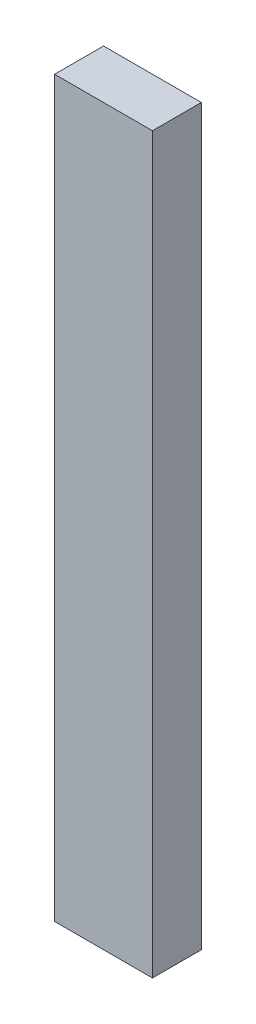
ISO-10303-21;
HEADER;
FILE_DESCRIPTION(('STEP AP214'),'2;1');
FILE_NAME('part.step','',(''),(''),'','','');
FILE_SCHEMA(('AUTOMOTIVE_DESIGN { 1 0 10303 214 1 1 1 1 }'));
ENDSEC;
DATA;
#1=APPLICATION_CONTEXT('core data for automotive mechanical design processes');
#2=APPLICATION_PROTOCOL_DEFINITION('international standard','automotive_design',2000,#1);
#3=PRODUCT_CONTEXT('',#1,'mechanical');
#4=PRODUCT('Part','Part','',(#3));
#5=PRODUCT_RELATED_PRODUCT_CATEGORY('part','',(#4));
#6=PRODUCT_DEFINITION_FORMATION('','',#4);
#7=PRODUCT_DEFINITION_CONTEXT('part definition',#1,'design');
#8=PRODUCT_DEFINITION('design','',#6,#7);
#9=PRODUCT_DEFINITION_SHAPE('','',#8);
#10=(LENGTH_UNIT() NAMED_UNIT(*) SI_UNIT(.MILLI.,.METRE.));
#11=(NAMED_UNIT(*) PLANE_ANGLE_UNIT() SI_UNIT($,.RADIAN.));
#12=(NAMED_UNIT(*) SI_UNIT($,.STERADIAN.) SOLID_ANGLE_UNIT());
#13=UNCERTAINTY_MEASURE_WITH_UNIT(LENGTH_MEASURE(1.E-05),#10,'distance_accuracy_value','');
#14=(GEOMETRIC_REPRESENTATION_CONTEXT(3) GLOBAL_UNCERTAINTY_ASSIGNED_CONTEXT((#13)) GLOBAL_UNIT_ASSIGNED_CONTEXT((#10,
#11,#12)) REPRESENTATION_CONTEXT('',''));
#15=CARTESIAN_POINT('',(0.,0.,0.));
#16=DIRECTION('',(0.,0.,1.));
#17=DIRECTION('',(1.,0.,0.));
#18=AXIS2_PLACEMENT_3D('',#15,#16,#17);
#19=CARTESIAN_POINT('',(0.,0.,0.));
#20=DIRECTION('',(0.,0.,1.));
#21=DIRECTION('',(1.,0.,0.));
#22=AXIS2_PLACEMENT_3D('',#19,#20,#21);
#23=PLANE('',#22);
#24=DIRECTION('',(0.,-1.,0.));
#25=VECTOR('',#24,1.);
#26=CARTESIAN_POINT('',(-51.9451952835684,48.2526807372689,0.));
#27=LINE('',#26,#25);
#28=CARTESIAN_POINT('',(-51.9451952835684,48.2526807372689,0.));
#29=VERTEX_POINT('',#28);
#30=CARTESIAN_POINT('',(-51.9451952835684,-101.747319262731,0.));
#31=VERTEX_POINT('',#30);
#32=EDGE_CURVE('E118',#29,#31,#27,.T.);
#33=ORIENTED_EDGE('',*,*,#32,.F.);
#34=DIRECTION('',(-1.,0.,0.));
#35=VECTOR('',#34,1.);
#36=CARTESIAN_POINT('',(-51.9451952835684,48.2526807372689,0.));
#37=LINE('',#36,#35);
#38=CARTESIAN_POINT('',(-31.9451952835684,48.2526807372689,0.));
#39=VERTEX_POINT('',#38);
#40=EDGE_CURVE('E189',#39,#29,#37,.T.);
#41=ORIENTED_EDGE('',*,*,#40,.F.);
#42=DIRECTION('',(0.,1.,0.));
#43=VECTOR('',#42,1.);
#44=CARTESIAN_POINT('',(-31.9451952835684,48.2526807372689,0.));
#45=LINE('',#44,#43);
#46=CARTESIAN_POINT('',(-31.9451952835684,-101.747319262731,0.));
#47=VERTEX_POINT('',#46);
#48=EDGE_CURVE('E186',#47,#39,#45,.T.);
#49=ORIENTED_EDGE('',*,*,#48,.F.);
#50=DIRECTION('',(1.,0.,0.));
#51=VECTOR('',#50,1.);
#52=CARTESIAN_POINT('',(-51.9451952835684,-101.747319262731,0.));
#53=LINE('',#52,#51);
#54=EDGE_CURVE('E183',#31,#47,#53,.T.);
#55=ORIENTED_EDGE('',*,*,#54,.F.);
#56=EDGE_LOOP('',(#33,#41,#49,#55));
#57=FACE_BOUND('',#56,.T.);
#58=CARTESIAN_POINT('',(-41.9451952835684,38.2526807372689,0.));
#59=DIRECTION('',(0.,0.,1.));
#60=DIRECTION('',(1.,0.,0.));
#61=AXIS2_PLACEMENT_3D('',#58,#59,#60);
#62=CIRCLE('',#61,3.55);
#63=CARTESIAN_POINT('',(-38.3951952835684,38.2526807372689,0.));
#64=VERTEX_POINT('',#63);
#65=CARTESIAN_POINT('',(-45.4951952835684,38.2526807372689,0.));
#66=VERTEX_POINT('',#65);
#67=EDGE_CURVE('E69',#64,#66,#62,.T.);
#68=ORIENTED_EDGE('',*,*,#67,.T.);
#69=DIRECTION('',(0.0343547085329042,-0.999409702775403,0.));
#70=VECTOR('',#69,1.);
#71=CARTESIAN_POINT('',(-45.4951952835684,38.2526807372689,0.));
#72=LINE('',#71,#70);
#73=CARTESIAN_POINT('',(-44.9451952835684,22.2526807372689,0.));
#74=VERTEX_POINT('',#73);
#75=EDGE_CURVE('E159',#66,#74,#72,.T.);
#76=ORIENTED_EDGE('',*,*,#75,.T.);
#77=CARTESIAN_POINT('',(-41.9451952835684,22.2526807372689,0.));
#78=DIRECTION('',(0.,0.,1.));
#79=DIRECTION('',(1.,0.,0.));
#80=AXIS2_PLACEMENT_3D('',#77,#78,#79);
#81=CIRCLE('',#80,3.);
#82=CARTESIAN_POINT('',(-38.9451952835684,22.2526807372689,0.));
#83=VERTEX_POINT('',#82);
#84=EDGE_CURVE('E163',#74,#83,#81,.T.);
#85=ORIENTED_EDGE('',*,*,#84,.T.);
#86=DIRECTION('',(0.0343547085329042,0.999409702775403,0.));
#87=VECTOR('',#86,1.);
#88=CARTESIAN_POINT('',(-38.3951952835684,38.2526807372689,0.));
#89=LINE('',#88,#87);
#90=EDGE_CURVE('E146',#83,#64,#89,.T.);
#91=ORIENTED_EDGE('',*,*,#90,.T.);
#92=EDGE_LOOP('',(#68,#76,#85,#91));
#93=FACE_BOUND('',#92,.T.);
#94=ADVANCED_FACE('F45',(#57,#93),#23,.F.);
#95=CARTESIAN_POINT('',(-51.9451952835684,48.2526807372689,5.));
#96=DIRECTION('',(1.,0.,0.));
#97=DIRECTION('',(0.,1.,0.));
#98=AXIS2_PLACEMENT_3D('',#95,#96,#97);
#99=PLANE('',#98);
#100=ORIENTED_EDGE('',*,*,#32,.T.);
#101=DIRECTION('',(0.,0.,-1.));
#102=VECTOR('',#101,1.);
#103=CARTESIAN_POINT('',(-51.9451952835684,-101.747319262731,5.));
#104=LINE('',#103,#102);
#105=CARTESIAN_POINT('',(-51.9451952835684,-101.747319262731,10.));
#106=VERTEX_POINT('',#105);
#107=EDGE_CURVE('E11',#106,#31,#104,.T.);
#108=ORIENTED_EDGE('',*,*,#107,.F.);
#109=DIRECTION('',(0.,-1.,0.));
#110=VECTOR('',#109,1.);
#111=CARTESIAN_POINT('',(-51.9451952835684,48.2526807372689,10.));
#112=LINE('',#111,#110);
#113=CARTESIAN_POINT('',(-51.9451952835684,48.2526807372689,10.));
#114=VERTEX_POINT('',#113);
#115=EDGE_CURVE('E116',#114,#106,#112,.T.);
#116=ORIENTED_EDGE('',*,*,#115,.F.);
#117=DIRECTION('',(0.,0.,-1.));
#118=VECTOR('',#117,1.);
#119=CARTESIAN_POINT('',(-51.9451952835684,48.2526807372689,5.));
#120=LINE('',#119,#118);
#121=EDGE_CURVE('E192',#114,#29,#120,.T.);
#122=ORIENTED_EDGE('',*,*,#121,.T.);
#123=EDGE_LOOP('',(#100,#108,#116,#122));
#124=FACE_BOUND('',#123,.T.);
#125=ADVANCED_FACE('F47',(#124),#99,.F.);
#126=CARTESIAN_POINT('',(-51.9451952835684,-101.747319262731,5.));
#127=DIRECTION('',(0.,1.,0.));
#128=DIRECTION('',(0.,0.,1.));
#129=AXIS2_PLACEMENT_3D('',#126,#127,#128);
#130=PLANE('',#129);
#131=ORIENTED_EDGE('',*,*,#54,.T.);
#132=DIRECTION('',(0.,0.,-1.));
#133=VECTOR('',#132,1.);
#134=CARTESIAN_POINT('',(-31.9451952835684,-101.747319262731,5.));
#135=LINE('',#134,#133);
#136=CARTESIAN_POINT('',(-31.9451952835684,-101.747319262731,10.));
#137=VERTEX_POINT('',#136);
#138=EDGE_CURVE('E54',#137,#47,#135,.T.);
#139=ORIENTED_EDGE('',*,*,#138,.F.);
#140=DIRECTION('',(1.,0.,0.));
#141=VECTOR('',#140,1.);
#142=CARTESIAN_POINT('',(-51.9451952835684,-101.747319262731,10.));
#143=LINE('',#142,#141);
#144=EDGE_CURVE('E121',#106,#137,#143,.T.);
#145=ORIENTED_EDGE('',*,*,#144,.F.);
#146=ORIENTED_EDGE('',*,*,#107,.T.);
#147=EDGE_LOOP('',(#131,#139,#145,#146));
#148=FACE_BOUND('',#147,.T.);
#149=ADVANCED_FACE('F122',(#148),#130,.F.);
#150=CARTESIAN_POINT('',(-31.9451952835684,48.2526807372689,5.));
#151=DIRECTION('',(-1.,0.,0.));
#152=DIRECTION('',(0.,-1.,0.));
#153=AXIS2_PLACEMENT_3D('',#150,#151,#152);
#154=PLANE('',#153);
#155=ORIENTED_EDGE('',*,*,#48,.T.);
#156=DIRECTION('',(0.,0.,-1.));
#157=VECTOR('',#156,1.);
#158=CARTESIAN_POINT('',(-31.9451952835684,48.2526807372689,5.));
#159=LINE('',#158,#157);
#160=CARTESIAN_POINT('',(-31.9451952835684,48.2526807372689,10.));
#161=VERTEX_POINT('',#160);
#162=EDGE_CURVE('E195',#161,#39,#159,.T.);
#163=ORIENTED_EDGE('',*,*,#162,.F.);
#164=DIRECTION('',(0.,1.,0.));
#165=VECTOR('',#164,1.);
#166=CARTESIAN_POINT('',(-31.9451952835684,48.2526807372689,10.));
#167=LINE('',#166,#165);
#168=EDGE_CURVE('E128',#137,#161,#167,.T.);
#169=ORIENTED_EDGE('',*,*,#168,.F.);
#170=ORIENTED_EDGE('',*,*,#138,.T.);
#171=EDGE_LOOP('',(#155,#163,#169,#170));
#172=FACE_BOUND('',#171,.T.);
#173=ADVANCED_FACE('F201',(#172),#154,.F.);
#174=CARTESIAN_POINT('',(-51.9451952835684,48.2526807372689,5.));
#175=DIRECTION('',(0.,-1.,0.));
#176=DIRECTION('',(0.,0.,-1.));
#177=AXIS2_PLACEMENT_3D('',#174,#175,#176);
#178=PLANE('',#177);
#179=ORIENTED_EDGE('',*,*,#40,.T.);
#180=ORIENTED_EDGE('',*,*,#121,.F.);
#181=DIRECTION('',(-1.,0.,0.));
#182=VECTOR('',#181,1.);
#183=CARTESIAN_POINT('',(-51.9451952835684,48.2526807372689,10.));
#184=LINE('',#183,#182);
#185=EDGE_CURVE('E133',#161,#114,#184,.T.);
#186=ORIENTED_EDGE('',*,*,#185,.F.);
#187=ORIENTED_EDGE('',*,*,#162,.T.);
#188=EDGE_LOOP('',(#179,#180,#186,#187));
#189=FACE_BOUND('',#188,.T.);
#190=ADVANCED_FACE('F206',(#189),#178,.F.);
#191=CARTESIAN_POINT('',(-41.9451952835684,38.2526807372689,5.));
#192=DIRECTION('',(0.,0.,-1.));
#193=DIRECTION('',(-1.,0.,0.));
#194=AXIS2_PLACEMENT_3D('',#191,#192,#193);
#195=CYLINDRICAL_SURFACE('',#194,3.55);
#196=ORIENTED_EDGE('',*,*,#67,.F.);
#197=DIRECTION('',(0.,0.,-1.));
#198=VECTOR('',#197,1.);
#199=CARTESIAN_POINT('',(-38.3951952835684,38.2526807372689,5.));
#200=LINE('',#199,#198);
#201=CARTESIAN_POINT('',(-38.3951952835684,38.2526807372689,5.));
#202=VERTEX_POINT('',#201);
#203=EDGE_CURVE('E156',#202,#64,#200,.T.);
#204=ORIENTED_EDGE('',*,*,#203,.F.);
#205=CARTESIAN_POINT('',(-41.9451952835684,38.2526807372689,5.));
#206=DIRECTION('',(0.,0.,1.));
#207=DIRECTION('',(1.,0.,0.));
#208=AXIS2_PLACEMENT_3D('',#205,#206,#207);
#209=CIRCLE('',#208,3.55);
#210=CARTESIAN_POINT('',(-45.4951952835684,38.2526807372689,5.));
#211=VERTEX_POINT('',#210);
#212=EDGE_CURVE('E141',#202,#211,#209,.T.);
#213=ORIENTED_EDGE('',*,*,#212,.T.);
#214=DIRECTION('',(0.,0.,-1.));
#215=VECTOR('',#214,1.);
#216=CARTESIAN_POINT('',(-45.4951952835684,38.2526807372689,5.));
#217=LINE('',#216,#215);
#218=EDGE_CURVE('E178',#211,#66,#217,.T.);
#219=ORIENTED_EDGE('',*,*,#218,.T.);
#220=EDGE_LOOP('',(#196,#204,#213,#219));
#221=FACE_BOUND('',#220,.T.);
#222=ADVANCED_FACE('F208',(#221),#195,.F.);
#223=CARTESIAN_POINT('',(-45.4951952835684,38.2526807372689,5.));
#224=DIRECTION('',(0.999409702775403,0.0343547085329042,0.));
#225=DIRECTION('',(-0.0343547085329042,0.999409702775403,0.));
#226=AXIS2_PLACEMENT_3D('',#223,#224,#225);
#227=PLANE('',#226);
#228=ORIENTED_EDGE('',*,*,#75,.F.);
#229=ORIENTED_EDGE('',*,*,#218,.F.);
#230=DIRECTION('',(0.0343547085329042,-0.999409702775403,0.));
#231=VECTOR('',#230,1.);
#232=CARTESIAN_POINT('',(-45.4951952835684,38.2526807372689,5.));
#233=LINE('',#232,#231);
#234=CARTESIAN_POINT('',(-44.9451952835684,22.2526807372689,5.));
#235=VERTEX_POINT('',#234);
#236=EDGE_CURVE('E145',#211,#235,#233,.T.);
#237=ORIENTED_EDGE('',*,*,#236,.T.);
#238=DIRECTION('',(0.,0.,-1.));
#239=VECTOR('',#238,1.);
#240=CARTESIAN_POINT('',(-44.9451952835684,22.2526807372689,5.));
#241=LINE('',#240,#239);
#242=EDGE_CURVE('E175',#235,#74,#241,.T.);
#243=ORIENTED_EDGE('',*,*,#242,.T.);
#244=EDGE_LOOP('',(#228,#229,#237,#243));
#245=FACE_BOUND('',#244,.T.);
#246=ADVANCED_FACE('F214',(#245),#227,.T.);
#247=CARTESIAN_POINT('',(-41.9451952835684,22.2526807372689,5.));
#248=DIRECTION('',(0.,0.,-1.));
#249=DIRECTION('',(-1.,0.,0.));
#250=AXIS2_PLACEMENT_3D('',#247,#248,#249);
#251=CYLINDRICAL_SURFACE('',#250,3.);
#252=ORIENTED_EDGE('',*,*,#84,.F.);
#253=ORIENTED_EDGE('',*,*,#242,.F.);
#254=CARTESIAN_POINT('',(-41.9451952835684,22.2526807372689,5.));
#255=DIRECTION('',(0.,0.,1.));
#256=DIRECTION('',(1.,0.,0.));
#257=AXIS2_PLACEMENT_3D('',#254,#255,#256);
#258=CIRCLE('',#257,3.);
#259=CARTESIAN_POINT('',(-38.9451952835684,22.2526807372689,5.));
#260=VERTEX_POINT('',#259);
#261=EDGE_CURVE('E150',#235,#260,#258,.T.);
#262=ORIENTED_EDGE('',*,*,#261,.T.);
#263=DIRECTION('',(0.,0.,-1.));
#264=VECTOR('',#263,1.);
#265=CARTESIAN_POINT('',(-38.9451952835684,22.2526807372689,5.));
#266=LINE('',#265,#264);
#267=EDGE_CURVE('E172',#260,#83,#266,.T.);
#268=ORIENTED_EDGE('',*,*,#267,.T.);
#269=EDGE_LOOP('',(#252,#253,#262,#268));
#270=FACE_BOUND('',#269,.T.);
#271=ADVANCED_FACE('F225',(#270),#251,.F.);
#272=CARTESIAN_POINT('',(-38.3951952835684,38.2526807372689,5.));
#273=DIRECTION('',(-0.999409702775403,0.0343547085329042,0.));
#274=DIRECTION('',(-0.0343547085329042,-0.999409702775403,0.));
#275=AXIS2_PLACEMENT_3D('',#272,#273,#274);
#276=PLANE('',#275);
#277=ORIENTED_EDGE('',*,*,#90,.F.);
#278=ORIENTED_EDGE('',*,*,#267,.F.);
#279=DIRECTION('',(0.0343547085329042,0.999409702775403,0.));
#280=VECTOR('',#279,1.);
#281=CARTESIAN_POINT('',(-38.3951952835684,38.2526807372689,5.));
#282=LINE('',#281,#280);
#283=EDGE_CURVE('E61',#260,#202,#282,.T.);
#284=ORIENTED_EDGE('',*,*,#283,.T.);
#285=ORIENTED_EDGE('',*,*,#203,.T.);
#286=EDGE_LOOP('',(#277,#278,#284,#285));
#287=FACE_BOUND('',#286,.T.);
#288=ADVANCED_FACE('F229',(#287),#276,.T.);
#289=CARTESIAN_POINT('',(0.,0.,5.));
#290=DIRECTION('',(0.,0.,1.));
#291=DIRECTION('',(1.,0.,0.));
#292=AXIS2_PLACEMENT_3D('',#289,#290,#291);
#293=PLANE('',#292);
#294=ORIENTED_EDGE('',*,*,#236,.F.);
#295=ORIENTED_EDGE('',*,*,#212,.F.);
#296=ORIENTED_EDGE('',*,*,#283,.F.);
#297=ORIENTED_EDGE('',*,*,#261,.F.);
#298=EDGE_LOOP('',(#294,#295,#296,#297));
#299=FACE_BOUND('',#298,.T.);
#300=ADVANCED_FACE('F233',(#299),#293,.F.);
#301=CARTESIAN_POINT('',(0.,0.,10.));
#302=DIRECTION('',(0.,0.,1.));
#303=DIRECTION('',(1.,0.,0.));
#304=AXIS2_PLACEMENT_3D('',#301,#302,#303);
#305=PLANE('',#304);
#306=ORIENTED_EDGE('',*,*,#115,.T.);
#307=ORIENTED_EDGE('',*,*,#144,.T.);
#308=ORIENTED_EDGE('',*,*,#168,.T.);
#309=ORIENTED_EDGE('',*,*,#185,.T.);
#310=EDGE_LOOP('',(#306,#307,#308,#309));
#311=FACE_BOUND('',#310,.T.);
#312=ADVANCED_FACE('F131',(#311),#305,.T.);
#313=CLOSED_SHELL('',(#94,#125,#149,#173,#190,#222,#246,#271,#288,#300,#312));
#314=MANIFOLD_SOLID_BREP('B2',#313);
#315=ADVANCED_BREP_SHAPE_REPRESENTATION('',(#18,#314),#14);
#316=SHAPE_DEFINITION_REPRESENTATION(#9,#315);
ENDSEC;
END-ISO-10303-21;
